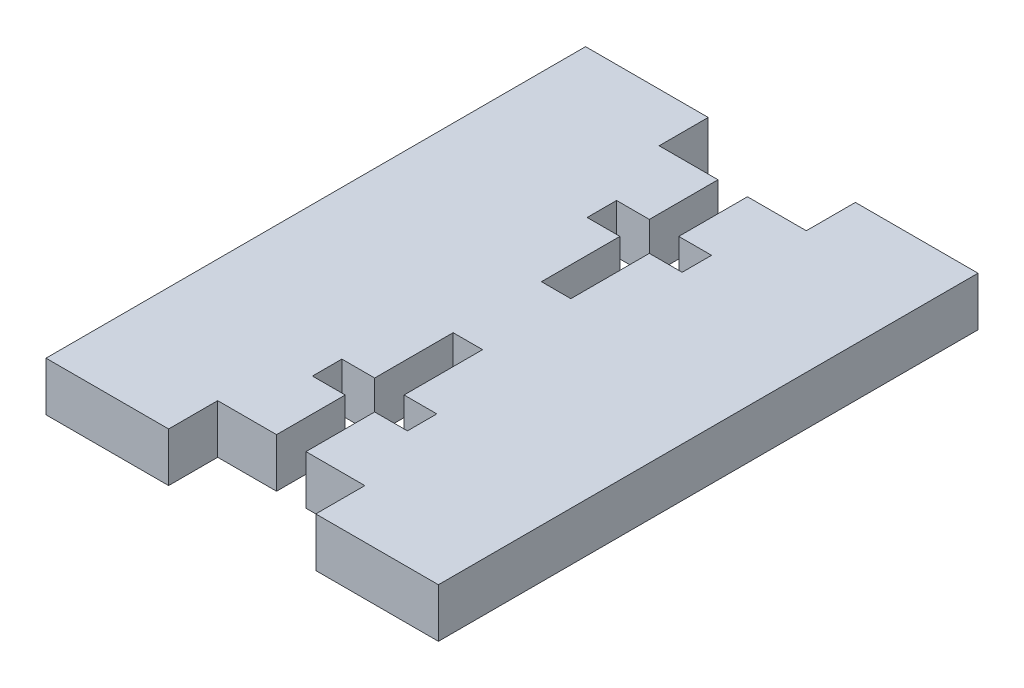
ISO-10303-21;
HEADER;
FILE_DESCRIPTION(('STEP AP214'),'2;1');
FILE_NAME('part.step','',(''),(''),'','','');
FILE_SCHEMA(('AUTOMOTIVE_DESIGN { 1 0 10303 214 1 1 1 1 }'));
ENDSEC;
DATA;
#1=APPLICATION_CONTEXT('core data for automotive mechanical design processes');
#2=APPLICATION_PROTOCOL_DEFINITION('international standard','automotive_design',2000,#1);
#3=PRODUCT_CONTEXT('',#1,'mechanical');
#4=PRODUCT('Part','Part','',(#3));
#5=PRODUCT_RELATED_PRODUCT_CATEGORY('part','',(#4));
#6=PRODUCT_DEFINITION_FORMATION('','',#4);
#7=PRODUCT_DEFINITION_CONTEXT('part definition',#1,'design');
#8=PRODUCT_DEFINITION('design','',#6,#7);
#9=PRODUCT_DEFINITION_SHAPE('','',#8);
#10=(LENGTH_UNIT() NAMED_UNIT(*) SI_UNIT(.MILLI.,.METRE.));
#11=(NAMED_UNIT(*) PLANE_ANGLE_UNIT() SI_UNIT($,.RADIAN.));
#12=(NAMED_UNIT(*) SI_UNIT($,.STERADIAN.) SOLID_ANGLE_UNIT());
#13=UNCERTAINTY_MEASURE_WITH_UNIT(LENGTH_MEASURE(1.E-05),#10,'distance_accuracy_value','');
#14=(GEOMETRIC_REPRESENTATION_CONTEXT(3) GLOBAL_UNCERTAINTY_ASSIGNED_CONTEXT((#13)) GLOBAL_UNIT_ASSIGNED_CONTEXT((#10,
#11,#12)) REPRESENTATION_CONTEXT('',''));
#15=CARTESIAN_POINT('',(0.,0.,0.));
#16=DIRECTION('',(0.,0.,1.));
#17=DIRECTION('',(1.,0.,0.));
#18=AXIS2_PLACEMENT_3D('',#15,#16,#17);
#19=CARTESIAN_POINT('',(-42.0649491402793,-5.,21.7189241382306));
#20=DIRECTION('',(0.,0.,-1.));
#21=DIRECTION('',(1.,0.,0.));
#22=AXIS2_PLACEMENT_3D('',#19,#20,#21);
#23=PLANE('',#22);
#24=DIRECTION('',(1.,0.,0.));
#25=VECTOR('',#24,1.);
#26=CARTESIAN_POINT('',(-42.0649491402793,0.,21.7189241382306));
#27=LINE('',#26,#25);
#28=CARTESIAN_POINT('',(-42.0649491402793,0.,21.7189241382306));
#29=VERTEX_POINT('',#28);
#30=CARTESIAN_POINT('',(-36.0649491402793,0.,21.7189241382306));
#31=VERTEX_POINT('',#30);
#32=EDGE_CURVE('E476',#29,#31,#27,.T.);
#33=ORIENTED_EDGE('',*,*,#32,.F.);
#34=DIRECTION('',(0.,1.,0.));
#35=VECTOR('',#34,1.);
#36=CARTESIAN_POINT('',(-42.0649491402793,-5.,21.7189241382306));
#37=LINE('',#36,#35);
#38=CARTESIAN_POINT('',(-42.0649491402793,-5.,21.7189241382306));
#39=VERTEX_POINT('',#38);
#40=EDGE_CURVE('E486',#39,#29,#37,.T.);
#41=ORIENTED_EDGE('',*,*,#40,.F.);
#42=DIRECTION('',(1.,0.,0.));
#43=VECTOR('',#42,1.);
#44=CARTESIAN_POINT('',(-42.0649491402793,-5.,21.7189241382306));
#45=LINE('',#44,#43);
#46=CARTESIAN_POINT('',(-36.0649491402793,-5.,21.7189241382306));
#47=VERTEX_POINT('',#46);
#48=EDGE_CURVE('E468',#39,#47,#45,.T.);
#49=ORIENTED_EDGE('',*,*,#48,.T.);
#50=DIRECTION('',(0.,1.,0.));
#51=VECTOR('',#50,1.);
#52=CARTESIAN_POINT('',(-36.0649491402793,-5.,21.7189241382306));
#53=LINE('',#52,#51);
#54=EDGE_CURVE('E362',#47,#31,#53,.T.);
#55=ORIENTED_EDGE('',*,*,#54,.T.);
#56=EDGE_LOOP('',(#33,#41,#49,#55));
#57=FACE_BOUND('',#56,.T.);
#58=ADVANCED_FACE('F37',(#57),#23,.F.);
#59=CARTESIAN_POINT('',(-42.0649491402793,-5.,-23.2810758617694));
#60=DIRECTION('',(0.,0.,1.));
#61=DIRECTION('',(-1.,0.,0.));
#62=AXIS2_PLACEMENT_3D('',#59,#60,#61);
#63=PLANE('',#62);
#64=DIRECTION('',(-1.,0.,0.));
#65=VECTOR('',#64,1.);
#66=CARTESIAN_POINT('',(-42.0649491402793,0.,-23.2810758617694));
#67=LINE('',#66,#65);
#68=CARTESIAN_POINT('',(-27.0649491402793,0.,-23.2810758617694));
#69=VERTEX_POINT('',#68);
#70=CARTESIAN_POINT('',(-33.0649491402793,0.,-23.2810758617694));
#71=VERTEX_POINT('',#70);
#72=EDGE_CURVE('E494',#69,#71,#67,.T.);
#73=ORIENTED_EDGE('',*,*,#72,.F.);
#74=DIRECTION('',(0.,1.,0.));
#75=VECTOR('',#74,1.);
#76=CARTESIAN_POINT('',(-27.0649491402793,-5.,-23.2810758617694));
#77=LINE('',#76,#75);
#78=CARTESIAN_POINT('',(-27.0649491402793,-5.,-23.2810758617694));
#79=VERTEX_POINT('',#78);
#80=EDGE_CURVE('E510',#79,#69,#77,.T.);
#81=ORIENTED_EDGE('',*,*,#80,.F.);
#82=DIRECTION('',(-1.,0.,0.));
#83=VECTOR('',#82,1.);
#84=CARTESIAN_POINT('',(-42.0649491402793,-5.,-23.2810758617694));
#85=LINE('',#84,#83);
#86=CARTESIAN_POINT('',(-33.0649491402793,-5.,-23.2810758617694));
#87=VERTEX_POINT('',#86);
#88=EDGE_CURVE('E497',#79,#87,#85,.T.);
#89=ORIENTED_EDGE('',*,*,#88,.T.);
#90=DIRECTION('',(0.,1.,0.));
#91=VECTOR('',#90,1.);
#92=CARTESIAN_POINT('',(-33.0649491402793,-5.,-23.2810758617694));
#93=LINE('',#92,#91);
#94=EDGE_CURVE('E457',#87,#71,#93,.T.);
#95=ORIENTED_EDGE('',*,*,#94,.T.);
#96=EDGE_LOOP('',(#73,#81,#89,#95));
#97=FACE_BOUND('',#96,.T.);
#98=ADVANCED_FACE('F603',(#97),#63,.F.);
#99=CARTESIAN_POINT('',(-54.5649491402793,-5.,26.7189241382306));
#100=DIRECTION('',(0.,0.,1.));
#101=DIRECTION('',(-1.,0.,0.));
#102=AXIS2_PLACEMENT_3D('',#99,#100,#101);
#103=PLANE('',#102);
#104=DIRECTION('',(0.,1.,0.));
#105=VECTOR('',#104,1.);
#106=CARTESIAN_POINT('',(-27.0649491402793,-5.,26.7189241382306));
#107=LINE('',#106,#105);
#108=CARTESIAN_POINT('',(-27.0649491402793,-5.,26.7189241382306));
#109=VERTEX_POINT('',#108);
#110=CARTESIAN_POINT('',(-27.0649491402793,0.,26.7189241382306));
#111=VERTEX_POINT('',#110);
#112=EDGE_CURVE('E480',#109,#111,#107,.T.);
#113=ORIENTED_EDGE('',*,*,#112,.F.);
#114=DIRECTION('',(-1.,0.,0.));
#115=VECTOR('',#114,1.);
#116=CARTESIAN_POINT('',(-54.5649491402793,-5.,26.7189241382306));
#117=LINE('',#116,#115);
#118=CARTESIAN_POINT('',(-14.5649491402793,-5.,26.7189241382306));
#119=VERTEX_POINT('',#118);
#120=EDGE_CURVE('E528',#119,#109,#117,.T.);
#121=ORIENTED_EDGE('',*,*,#120,.F.);
#122=DIRECTION('',(0.,1.,0.));
#123=VECTOR('',#122,1.);
#124=CARTESIAN_POINT('',(-14.5649491402793,-5.,26.7189241382306));
#125=LINE('',#124,#123);
#126=CARTESIAN_POINT('',(-14.5649491402793,0.,26.7189241382306));
#127=VERTEX_POINT('',#126);
#128=EDGE_CURVE('E46',#119,#127,#125,.T.);
#129=ORIENTED_EDGE('',*,*,#128,.T.);
#130=DIRECTION('',(-1.,0.,0.));
#131=VECTOR('',#130,1.);
#132=CARTESIAN_POINT('',(-54.5649491402793,0.,26.7189241382306));
#133=LINE('',#132,#131);
#134=EDGE_CURVE('E521',#127,#111,#133,.T.);
#135=ORIENTED_EDGE('',*,*,#134,.T.);
#136=EDGE_LOOP('',(#113,#121,#129,#135));
#137=FACE_BOUND('',#136,.T.);
#138=ADVANCED_FACE('F609',(#137),#103,.T.);
#139=CARTESIAN_POINT('',(-54.5649491402793,-5.,-28.2810758617694));
#140=DIRECTION('',(0.,0.,-1.));
#141=DIRECTION('',(1.,0.,0.));
#142=AXIS2_PLACEMENT_3D('',#139,#140,#141);
#143=PLANE('',#142);
#144=DIRECTION('',(0.,1.,0.));
#145=VECTOR('',#144,1.);
#146=CARTESIAN_POINT('',(-42.0649491402793,-5.,-28.2810758617694));
#147=LINE('',#146,#145);
#148=CARTESIAN_POINT('',(-42.0649491402793,-5.,-28.2810758617694));
#149=VERTEX_POINT('',#148);
#150=CARTESIAN_POINT('',(-42.0649491402793,0.,-28.2810758617694));
#151=VERTEX_POINT('',#150);
#152=EDGE_CURVE('E500',#149,#151,#147,.T.);
#153=ORIENTED_EDGE('',*,*,#152,.F.);
#154=DIRECTION('',(1.,0.,0.));
#155=VECTOR('',#154,1.);
#156=CARTESIAN_POINT('',(-54.5649491402793,-5.,-28.2810758617694));
#157=LINE('',#156,#155);
#158=CARTESIAN_POINT('',(-54.5649491402793,-5.,-28.2810758617694));
#159=VERTEX_POINT('',#158);
#160=EDGE_CURVE('E522',#159,#149,#157,.T.);
#161=ORIENTED_EDGE('',*,*,#160,.F.);
#162=DIRECTION('',(0.,1.,0.));
#163=VECTOR('',#162,1.);
#164=CARTESIAN_POINT('',(-54.5649491402793,-5.,-28.2810758617694));
#165=LINE('',#164,#163);
#166=CARTESIAN_POINT('',(-54.5649491402793,0.,-28.2810758617694));
#167=VERTEX_POINT('',#166);
#168=EDGE_CURVE('E41',#159,#167,#165,.T.);
#169=ORIENTED_EDGE('',*,*,#168,.T.);
#170=DIRECTION('',(1.,0.,0.));
#171=VECTOR('',#170,1.);
#172=CARTESIAN_POINT('',(-54.5649491402793,0.,-28.2810758617694));
#173=LINE('',#172,#171);
#174=EDGE_CURVE('E533',#167,#151,#173,.T.);
#175=ORIENTED_EDGE('',*,*,#174,.T.);
#176=EDGE_LOOP('',(#153,#161,#169,#175));
#177=FACE_BOUND('',#176,.T.);
#178=ADVANCED_FACE('F553',(#177),#143,.T.);
#179=CARTESIAN_POINT('',(-54.5649491402793,-5.,-28.2810758617694));
#180=DIRECTION('',(-1.,0.,0.));
#181=DIRECTION('',(0.,0.,-1.));
#182=AXIS2_PLACEMENT_3D('',#179,#180,#181);
#183=PLANE('',#182);
#184=DIRECTION('',(0.,0.,-1.));
#185=VECTOR('',#184,1.);
#186=CARTESIAN_POINT('',(-54.5649491402793,0.,-28.2810758617694));
#187=LINE('',#186,#185);
#188=CARTESIAN_POINT('',(-54.5649491402793,0.,26.7189241382306));
#189=VERTEX_POINT('',#188);
#190=EDGE_CURVE('E509',#189,#167,#187,.T.);
#191=ORIENTED_EDGE('',*,*,#190,.T.);
#192=ORIENTED_EDGE('',*,*,#168,.F.);
#193=DIRECTION('',(0.,0.,-1.));
#194=VECTOR('',#193,1.);
#195=CARTESIAN_POINT('',(-54.5649491402793,-5.,-28.2810758617694));
#196=LINE('',#195,#194);
#197=CARTESIAN_POINT('',(-54.5649491402793,-5.,26.7189241382306));
#198=VERTEX_POINT('',#197);
#199=EDGE_CURVE('E518',#198,#159,#196,.T.);
#200=ORIENTED_EDGE('',*,*,#199,.F.);
#201=DIRECTION('',(0.,1.,0.));
#202=VECTOR('',#201,1.);
#203=CARTESIAN_POINT('',(-54.5649491402793,-5.,26.7189241382306));
#204=LINE('',#203,#202);
#205=EDGE_CURVE('E11',#198,#189,#204,.T.);
#206=ORIENTED_EDGE('',*,*,#205,.T.);
#207=EDGE_LOOP('',(#191,#192,#200,#206));
#208=FACE_BOUND('',#207,.T.);
#209=ADVANCED_FACE('F39',(#208),#183,.T.);
#210=DIRECTION('',(0.,1.,0.));
#211=VECTOR('',#210,1.);
#212=CARTESIAN_POINT('',(-42.0649491402793,-5.,26.7189241382306));
#213=LINE('',#212,#211);
#214=CARTESIAN_POINT('',(-42.0649491402793,-5.,26.7189241382306));
#215=VERTEX_POINT('',#214);
#216=CARTESIAN_POINT('',(-42.0649491402793,0.,26.7189241382306));
#217=VERTEX_POINT('',#216);
#218=EDGE_CURVE('E473',#215,#217,#213,.T.);
#219=ORIENTED_EDGE('',*,*,#218,.T.);
#220=EDGE_CURVE('E538',#217,#189,#133,.T.);
#221=ORIENTED_EDGE('',*,*,#220,.T.);
#222=ORIENTED_EDGE('',*,*,#205,.F.);
#223=EDGE_CURVE('E527',#215,#198,#117,.T.);
#224=ORIENTED_EDGE('',*,*,#223,.F.);
#225=EDGE_LOOP('',(#219,#221,#222,#224));
#226=FACE_BOUND('',#225,.T.);
#227=ADVANCED_FACE('F573',(#226),#103,.T.);
#228=CARTESIAN_POINT('',(-14.5649491402793,-5.,-28.2810758617694));
#229=DIRECTION('',(1.,0.,0.));
#230=DIRECTION('',(0.,0.,1.));
#231=AXIS2_PLACEMENT_3D('',#228,#229,#230);
#232=PLANE('',#231);
#233=DIRECTION('',(0.,0.,1.));
#234=VECTOR('',#233,1.);
#235=CARTESIAN_POINT('',(-14.5649491402793,0.,-28.2810758617694));
#236=LINE('',#235,#234);
#237=CARTESIAN_POINT('',(-14.5649491402793,0.,-28.2810758617694));
#238=VERTEX_POINT('',#237);
#239=EDGE_CURVE('E536',#238,#127,#236,.T.);
#240=ORIENTED_EDGE('',*,*,#239,.T.);
#241=ORIENTED_EDGE('',*,*,#128,.F.);
#242=DIRECTION('',(0.,0.,1.));
#243=VECTOR('',#242,1.);
#244=CARTESIAN_POINT('',(-14.5649491402793,-5.,-28.2810758617694));
#245=LINE('',#244,#243);
#246=CARTESIAN_POINT('',(-14.5649491402793,-5.,-28.2810758617694));
#247=VERTEX_POINT('',#246);
#248=EDGE_CURVE('E525',#247,#119,#245,.T.);
#249=ORIENTED_EDGE('',*,*,#248,.F.);
#250=DIRECTION('',(0.,1.,0.));
#251=VECTOR('',#250,1.);
#252=CARTESIAN_POINT('',(-14.5649491402793,-5.,-28.2810758617694));
#253=LINE('',#252,#251);
#254=EDGE_CURVE('E542',#247,#238,#253,.T.);
#255=ORIENTED_EDGE('',*,*,#254,.T.);
#256=EDGE_LOOP('',(#240,#241,#249,#255));
#257=FACE_BOUND('',#256,.T.);
#258=ADVANCED_FACE('F727',(#257),#232,.T.);
#259=DIRECTION('',(0.,1.,0.));
#260=VECTOR('',#259,1.);
#261=CARTESIAN_POINT('',(-27.0649491402793,-5.,-28.2810758617694));
#262=LINE('',#261,#260);
#263=CARTESIAN_POINT('',(-27.0649491402793,-5.,-28.2810758617694));
#264=VERTEX_POINT('',#263);
#265=CARTESIAN_POINT('',(-27.0649491402793,0.,-28.2810758617694));
#266=VERTEX_POINT('',#265);
#267=EDGE_CURVE('E513',#264,#266,#262,.T.);
#268=ORIENTED_EDGE('',*,*,#267,.T.);
#269=EDGE_CURVE('E532',#266,#238,#173,.T.);
#270=ORIENTED_EDGE('',*,*,#269,.T.);
#271=ORIENTED_EDGE('',*,*,#254,.F.);
#272=EDGE_CURVE('E520',#264,#247,#157,.T.);
#273=ORIENTED_EDGE('',*,*,#272,.F.);
#274=EDGE_LOOP('',(#268,#270,#271,#273));
#275=FACE_BOUND('',#274,.T.);
#276=ADVANCED_FACE('F722',(#275),#143,.T.);
#277=CARTESIAN_POINT('',(0.,-5.,0.));
#278=DIRECTION('',(0.,-1.,0.));
#279=DIRECTION('',(0.,0.,1.));
#280=AXIS2_PLACEMENT_3D('',#277,#278,#279);
#281=PLANE('',#280);
#282=DIRECTION('',(0.,0.,-1.));
#283=VECTOR('',#282,1.);
#284=CARTESIAN_POINT('',(-36.0649491402793,-5.,21.7189241382306));
#285=LINE('',#284,#283);
#286=CARTESIAN_POINT('',(-36.0649491402793,-5.,14.7189241382306));
#287=VERTEX_POINT('',#286);
#288=EDGE_CURVE('E315',#47,#287,#285,.T.);
#289=ORIENTED_EDGE('',*,*,#288,.F.);
#290=ORIENTED_EDGE('',*,*,#48,.F.);
#291=DIRECTION('',(0.,0.,-1.));
#292=VECTOR('',#291,1.);
#293=CARTESIAN_POINT('',(-42.0649491402793,-5.,26.7189241382306));
#294=LINE('',#293,#292);
#295=EDGE_CURVE('E464',#215,#39,#294,.T.);
#296=ORIENTED_EDGE('',*,*,#295,.F.);
#297=ORIENTED_EDGE('',*,*,#223,.T.);
#298=ORIENTED_EDGE('',*,*,#199,.T.);
#299=ORIENTED_EDGE('',*,*,#160,.T.);
#300=DIRECTION('',(0.,0.,-1.));
#301=VECTOR('',#300,1.);
#302=CARTESIAN_POINT('',(-42.0649491402793,-5.,-28.2810758617694));
#303=LINE('',#302,#301);
#304=CARTESIAN_POINT('',(-42.0649491402793,-5.,-23.2810758617694));
#305=VERTEX_POINT('',#304);
#306=EDGE_CURVE('E491',#305,#149,#303,.T.);
#307=ORIENTED_EDGE('',*,*,#306,.F.);
#308=CARTESIAN_POINT('',(-36.0649491402793,-5.,-23.2810758617694));
#309=VERTEX_POINT('',#308);
#310=EDGE_CURVE('E496',#309,#305,#85,.T.);
#311=ORIENTED_EDGE('',*,*,#310,.F.);
#312=DIRECTION('',(0.,0.,-1.));
#313=VECTOR('',#312,1.);
#314=CARTESIAN_POINT('',(-36.0649491402793,-5.,-23.2810758617694));
#315=LINE('',#314,#313);
#316=CARTESIAN_POINT('',(-36.0649491402793,-5.,-16.2810758617694));
#317=VERTEX_POINT('',#316);
#318=EDGE_CURVE('E382',#317,#309,#315,.T.);
#319=ORIENTED_EDGE('',*,*,#318,.F.);
#320=DIRECTION('',(1.,0.,0.));
#321=VECTOR('',#320,1.);
#322=CARTESIAN_POINT('',(-36.0649491402793,-5.,-16.2810758617694));
#323=LINE('',#322,#321);
#324=CARTESIAN_POINT('',(-39.4049491402793,-5.,-16.2810758617694));
#325=VERTEX_POINT('',#324);
#326=EDGE_CURVE('E378',#325,#317,#323,.T.);
#327=ORIENTED_EDGE('',*,*,#326,.F.);
#328=DIRECTION('',(0.,0.,-1.));
#329=VECTOR('',#328,1.);
#330=CARTESIAN_POINT('',(-39.4049491402793,-5.,-16.2810758617694));
#331=LINE('',#330,#329);
#332=CARTESIAN_POINT('',(-39.4049491402793,-5.,-13.2810758617694));
#333=VERTEX_POINT('',#332);
#334=EDGE_CURVE('E375',#333,#325,#331,.T.);
#335=ORIENTED_EDGE('',*,*,#334,.F.);
#336=DIRECTION('',(-1.,0.,0.));
#337=VECTOR('',#336,1.);
#338=CARTESIAN_POINT('',(-39.4049491402793,-5.,-13.2810758617694));
#339=LINE('',#338,#337);
#340=CARTESIAN_POINT('',(-36.0649491402793,-5.,-13.2810758617694));
#341=VERTEX_POINT('',#340);
#342=EDGE_CURVE('E405',#341,#333,#339,.T.);
#343=ORIENTED_EDGE('',*,*,#342,.F.);
#344=DIRECTION('',(0.,0.,-1.));
#345=VECTOR('',#344,1.);
#346=CARTESIAN_POINT('',(-36.0649491402793,-5.,-13.2810758617694));
#347=LINE('',#346,#345);
#348=CARTESIAN_POINT('',(-36.0649491402793,-5.,-5.2810758617694));
#349=VERTEX_POINT('',#348);
#350=EDGE_CURVE('E402',#349,#341,#347,.T.);
#351=ORIENTED_EDGE('',*,*,#350,.F.);
#352=DIRECTION('',(-1.,0.,0.));
#353=VECTOR('',#352,1.);
#354=CARTESIAN_POINT('',(-36.0649491402793,-5.,-5.2810758617694));
#355=LINE('',#354,#353);
#356=CARTESIAN_POINT('',(-33.0649491402793,-5.,-5.2810758617694));
#357=VERTEX_POINT('',#356);
#358=EDGE_CURVE('E399',#357,#349,#355,.T.);
#359=ORIENTED_EDGE('',*,*,#358,.F.);
#360=DIRECTION('',(0.,0.,1.));
#361=VECTOR('',#360,1.);
#362=CARTESIAN_POINT('',(-33.0649491402793,-5.,-5.2810758617694));
#363=LINE('',#362,#361);
#364=CARTESIAN_POINT('',(-33.0649491402793,-5.,-13.2810758617694));
#365=VERTEX_POINT('',#364);
#366=EDGE_CURVE('E396',#365,#357,#363,.T.);
#367=ORIENTED_EDGE('',*,*,#366,.F.);
#368=DIRECTION('',(-1.,0.,0.));
#369=VECTOR('',#368,1.);
#370=CARTESIAN_POINT('',(-33.0649491402793,-5.,-13.2810758617694));
#371=LINE('',#370,#369);
#372=CARTESIAN_POINT('',(-29.7249491402793,-5.,-13.2810758617694));
#373=VERTEX_POINT('',#372);
#374=EDGE_CURVE('E393',#373,#365,#371,.T.);
#375=ORIENTED_EDGE('',*,*,#374,.F.);
#376=DIRECTION('',(0.,0.,1.));
#377=VECTOR('',#376,1.);
#378=CARTESIAN_POINT('',(-29.7249491402793,-5.,-13.2810758617694));
#379=LINE('',#378,#377);
#380=CARTESIAN_POINT('',(-29.7249491402793,-5.,-16.2810758617694));
#381=VERTEX_POINT('',#380);
#382=EDGE_CURVE('E390',#381,#373,#379,.T.);
#383=ORIENTED_EDGE('',*,*,#382,.F.);
#384=DIRECTION('',(1.,0.,0.));
#385=VECTOR('',#384,1.);
#386=CARTESIAN_POINT('',(-29.7249491402793,-5.,-16.2810758617694));
#387=LINE('',#386,#385);
#388=CARTESIAN_POINT('',(-33.0649491402793,-5.,-16.2810758617694));
#389=VERTEX_POINT('',#388);
#390=EDGE_CURVE('E387',#389,#381,#387,.T.);
#391=ORIENTED_EDGE('',*,*,#390,.F.);
#392=DIRECTION('',(0.,0.,1.));
#393=VECTOR('',#392,1.);
#394=CARTESIAN_POINT('',(-33.0649491402793,-5.,-16.2810758617694));
#395=LINE('',#394,#393);
#396=EDGE_CURVE('E384',#87,#389,#395,.T.);
#397=ORIENTED_EDGE('',*,*,#396,.F.);
#398=ORIENTED_EDGE('',*,*,#88,.F.);
#399=DIRECTION('',(0.,0.,1.));
#400=VECTOR('',#399,1.);
#401=CARTESIAN_POINT('',(-27.0649491402793,-5.,-28.2810758617694));
#402=LINE('',#401,#400);
#403=EDGE_CURVE('E493',#264,#79,#402,.T.);
#404=ORIENTED_EDGE('',*,*,#403,.F.);
#405=ORIENTED_EDGE('',*,*,#272,.T.);
#406=ORIENTED_EDGE('',*,*,#248,.T.);
#407=ORIENTED_EDGE('',*,*,#120,.T.);
#408=DIRECTION('',(0.,0.,1.));
#409=VECTOR('',#408,1.);
#410=CARTESIAN_POINT('',(-27.0649491402793,-5.,26.7189241382306));
#411=LINE('',#410,#409);
#412=CARTESIAN_POINT('',(-27.0649491402793,-5.,21.7189241382306));
#413=VERTEX_POINT('',#412);
#414=EDGE_CURVE('E471',#413,#109,#411,.T.);
#415=ORIENTED_EDGE('',*,*,#414,.F.);
#416=CARTESIAN_POINT('',(-33.0649491402793,-5.,21.7189241382306));
#417=VERTEX_POINT('',#416);
#418=EDGE_CURVE('E466',#417,#413,#45,.T.);
#419=ORIENTED_EDGE('',*,*,#418,.F.);
#420=DIRECTION('',(0.,0.,1.));
#421=VECTOR('',#420,1.);
#422=CARTESIAN_POINT('',(-33.0649491402793,-5.,14.7189241382306));
#423=LINE('',#422,#421);
#424=CARTESIAN_POINT('',(-33.0649491402793,-5.,14.7189241382306));
#425=VERTEX_POINT('',#424);
#426=EDGE_CURVE('E313',#425,#417,#423,.T.);
#427=ORIENTED_EDGE('',*,*,#426,.F.);
#428=DIRECTION('',(-1.,0.,0.));
#429=VECTOR('',#428,1.);
#430=CARTESIAN_POINT('',(-29.7249491402793,-5.,14.7189241382306));
#431=LINE('',#430,#429);
#432=CARTESIAN_POINT('',(-29.7249491402793,-5.,14.7189241382306));
#433=VERTEX_POINT('',#432);
#434=EDGE_CURVE('E310',#433,#425,#431,.T.);
#435=ORIENTED_EDGE('',*,*,#434,.F.);
#436=DIRECTION('',(0.,0.,1.));
#437=VECTOR('',#436,1.);
#438=CARTESIAN_POINT('',(-29.7249491402793,-5.,11.7189241382306));
#439=LINE('',#438,#437);
#440=CARTESIAN_POINT('',(-29.7249491402793,-5.,11.7189241382306));
#441=VERTEX_POINT('',#440);
#442=EDGE_CURVE('E307',#441,#433,#439,.T.);
#443=ORIENTED_EDGE('',*,*,#442,.F.);
#444=DIRECTION('',(1.,0.,0.));
#445=VECTOR('',#444,1.);
#446=CARTESIAN_POINT('',(-33.0649491402794,-5.,11.7189241382306));
#447=LINE('',#446,#445);
#448=CARTESIAN_POINT('',(-33.0649491402794,-5.,11.7189241382306));
#449=VERTEX_POINT('',#448);
#450=EDGE_CURVE('E302',#449,#441,#447,.T.);
#451=ORIENTED_EDGE('',*,*,#450,.F.);
#452=DIRECTION('',(0.,0.,1.));
#453=VECTOR('',#452,1.);
#454=CARTESIAN_POINT('',(-33.0649491402793,-5.,3.71892413823061));
#455=LINE('',#454,#453);
#456=CARTESIAN_POINT('',(-33.0649491402793,-5.,3.71892413823061));
#457=VERTEX_POINT('',#456);
#458=EDGE_CURVE('E300',#457,#449,#455,.T.);
#459=ORIENTED_EDGE('',*,*,#458,.F.);
#460=DIRECTION('',(1.,0.,0.));
#461=VECTOR('',#460,1.);
#462=CARTESIAN_POINT('',(-36.0649491402793,-5.,3.71892413823061));
#463=LINE('',#462,#461);
#464=CARTESIAN_POINT('',(-36.0649491402793,-5.,3.71892413823061));
#465=VERTEX_POINT('',#464);
#466=EDGE_CURVE('E278',#465,#457,#463,.T.);
#467=ORIENTED_EDGE('',*,*,#466,.F.);
#468=DIRECTION('',(0.,0.,-1.));
#469=VECTOR('',#468,1.);
#470=CARTESIAN_POINT('',(-36.0649491402793,-5.,11.7189241382306));
#471=LINE('',#470,#469);
#472=CARTESIAN_POINT('',(-36.0649491402793,-5.,11.7189241382306));
#473=VERTEX_POINT('',#472);
#474=EDGE_CURVE('E289',#473,#465,#471,.T.);
#475=ORIENTED_EDGE('',*,*,#474,.F.);
#476=DIRECTION('',(1.,0.,0.));
#477=VECTOR('',#476,1.);
#478=CARTESIAN_POINT('',(-39.4049491402793,-5.,11.7189241382306));
#479=LINE('',#478,#477);
#480=CARTESIAN_POINT('',(-39.4049491402793,-5.,11.7189241382306));
#481=VERTEX_POINT('',#480);
#482=EDGE_CURVE('E286',#481,#473,#479,.T.);
#483=ORIENTED_EDGE('',*,*,#482,.F.);
#484=DIRECTION('',(0.,0.,-1.));
#485=VECTOR('',#484,1.);
#486=CARTESIAN_POINT('',(-39.4049491402793,-5.,14.7189241382306));
#487=LINE('',#486,#485);
#488=CARTESIAN_POINT('',(-39.4049491402793,-5.,14.7189241382306));
#489=VERTEX_POINT('',#488);
#490=EDGE_CURVE('E321',#489,#481,#487,.T.);
#491=ORIENTED_EDGE('',*,*,#490,.F.);
#492=DIRECTION('',(-1.,0.,0.));
#493=VECTOR('',#492,1.);
#494=CARTESIAN_POINT('',(-36.0649491402793,-5.,14.7189241382306));
#495=LINE('',#494,#493);
#496=EDGE_CURVE('E318',#287,#489,#495,.T.);
#497=ORIENTED_EDGE('',*,*,#496,.F.);
#498=EDGE_LOOP('',(#289,#290,#296,#297,#298,#299,#307,#311,#319,#327,#335,#343,#351,#359,#367,
#375,#383,#391,#397,#398,#404,#405,#406,#407,#415,#419,#427,#435,#443,#451,#459,#467,#475,#483,
#491,#497));
#499=FACE_BOUND('',#498,.T.);
#500=ADVANCED_FACE('F297',(#499),#281,.T.);
#501=CARTESIAN_POINT('',(0.,0.,0.));
#502=DIRECTION('',(0.,-1.,0.));
#503=DIRECTION('',(0.,0.,1.));
#504=AXIS2_PLACEMENT_3D('',#501,#502,#503);
#505=PLANE('',#504);
#506=DIRECTION('',(-1.,0.,0.));
#507=VECTOR('',#506,1.);
#508=CARTESIAN_POINT('',(-36.0649491402793,0.,14.7189241382306));
#509=LINE('',#508,#507);
#510=CARTESIAN_POINT('',(-36.0649491402793,0.,14.7189241382306));
#511=VERTEX_POINT('',#510);
#512=CARTESIAN_POINT('',(-39.4049491402793,0.,14.7189241382306));
#513=VERTEX_POINT('',#512);
#514=EDGE_CURVE('E346',#511,#513,#509,.T.);
#515=ORIENTED_EDGE('',*,*,#514,.T.);
#516=DIRECTION('',(0.,0.,-1.));
#517=VECTOR('',#516,1.);
#518=CARTESIAN_POINT('',(-39.4049491402793,0.,14.7189241382306));
#519=LINE('',#518,#517);
#520=CARTESIAN_POINT('',(-39.4049491402793,0.,11.7189241382306));
#521=VERTEX_POINT('',#520);
#522=EDGE_CURVE('E349',#513,#521,#519,.T.);
#523=ORIENTED_EDGE('',*,*,#522,.T.);
#524=DIRECTION('',(1.,0.,0.));
#525=VECTOR('',#524,1.);
#526=CARTESIAN_POINT('',(-39.4049491402793,0.,11.7189241382306));
#527=LINE('',#526,#525);
#528=CARTESIAN_POINT('',(-36.0649491402793,0.,11.7189241382306));
#529=VERTEX_POINT('',#528);
#530=EDGE_CURVE('E295',#521,#529,#527,.T.);
#531=ORIENTED_EDGE('',*,*,#530,.T.);
#532=DIRECTION('',(0.,0.,-1.));
#533=VECTOR('',#532,1.);
#534=CARTESIAN_POINT('',(-36.0649491402793,0.,11.7189241382306));
#535=LINE('',#534,#533);
#536=CARTESIAN_POINT('',(-36.0649491402793,0.,3.71892413823061));
#537=VERTEX_POINT('',#536);
#538=EDGE_CURVE('E325',#529,#537,#535,.T.);
#539=ORIENTED_EDGE('',*,*,#538,.T.);
#540=DIRECTION('',(1.,0.,0.));
#541=VECTOR('',#540,1.);
#542=CARTESIAN_POINT('',(-36.0649491402793,0.,3.71892413823061));
#543=LINE('',#542,#541);
#544=CARTESIAN_POINT('',(-33.0649491402793,0.,3.71892413823061));
#545=VERTEX_POINT('',#544);
#546=EDGE_CURVE('E281',#537,#545,#543,.T.);
#547=ORIENTED_EDGE('',*,*,#546,.T.);
#548=DIRECTION('',(0.,0.,1.));
#549=VECTOR('',#548,1.);
#550=CARTESIAN_POINT('',(-33.0649491402793,0.,3.71892413823061));
#551=LINE('',#550,#549);
#552=CARTESIAN_POINT('',(-33.0649491402794,0.,11.7189241382306));
#553=VERTEX_POINT('',#552);
#554=EDGE_CURVE('E328',#545,#553,#551,.T.);
#555=ORIENTED_EDGE('',*,*,#554,.T.);
#556=DIRECTION('',(1.,0.,0.));
#557=VECTOR('',#556,1.);
#558=CARTESIAN_POINT('',(-33.0649491402794,0.,11.7189241382306));
#559=LINE('',#558,#557);
#560=CARTESIAN_POINT('',(-29.7249491402793,0.,11.7189241382306));
#561=VERTEX_POINT('',#560);
#562=EDGE_CURVE('E331',#553,#561,#559,.T.);
#563=ORIENTED_EDGE('',*,*,#562,.T.);
#564=DIRECTION('',(0.,0.,1.));
#565=VECTOR('',#564,1.);
#566=CARTESIAN_POINT('',(-29.7249491402793,0.,11.7189241382306));
#567=LINE('',#566,#565);
#568=CARTESIAN_POINT('',(-29.7249491402793,0.,14.7189241382306));
#569=VERTEX_POINT('',#568);
#570=EDGE_CURVE('E334',#561,#569,#567,.T.);
#571=ORIENTED_EDGE('',*,*,#570,.T.);
#572=DIRECTION('',(-1.,0.,0.));
#573=VECTOR('',#572,1.);
#574=CARTESIAN_POINT('',(-29.7249491402793,0.,14.7189241382306));
#575=LINE('',#574,#573);
#576=CARTESIAN_POINT('',(-33.0649491402793,0.,14.7189241382306));
#577=VERTEX_POINT('',#576);
#578=EDGE_CURVE('E337',#569,#577,#575,.T.);
#579=ORIENTED_EDGE('',*,*,#578,.T.);
#580=DIRECTION('',(0.,0.,1.));
#581=VECTOR('',#580,1.);
#582=CARTESIAN_POINT('',(-33.0649491402793,0.,14.7189241382306));
#583=LINE('',#582,#581);
#584=CARTESIAN_POINT('',(-33.0649491402793,0.,21.7189241382306));
#585=VERTEX_POINT('',#584);
#586=EDGE_CURVE('E340',#577,#585,#583,.T.);
#587=ORIENTED_EDGE('',*,*,#586,.T.);
#588=CARTESIAN_POINT('',(-27.0649491402793,0.,21.7189241382306));
#589=VERTEX_POINT('',#588);
#590=EDGE_CURVE('E475',#585,#589,#27,.T.);
#591=ORIENTED_EDGE('',*,*,#590,.T.);
#592=DIRECTION('',(0.,0.,1.));
#593=VECTOR('',#592,1.);
#594=CARTESIAN_POINT('',(-27.0649491402793,0.,26.7189241382306));
#595=LINE('',#594,#593);
#596=EDGE_CURVE('E467',#589,#111,#595,.T.);
#597=ORIENTED_EDGE('',*,*,#596,.T.);
#598=ORIENTED_EDGE('',*,*,#134,.F.);
#599=ORIENTED_EDGE('',*,*,#239,.F.);
#600=ORIENTED_EDGE('',*,*,#269,.F.);
#601=DIRECTION('',(0.,0.,1.));
#602=VECTOR('',#601,1.);
#603=CARTESIAN_POINT('',(-27.0649491402793,0.,-28.2810758617694));
#604=LINE('',#603,#602);
#605=EDGE_CURVE('E502',#266,#69,#604,.T.);
#606=ORIENTED_EDGE('',*,*,#605,.T.);
#607=ORIENTED_EDGE('',*,*,#72,.T.);
#608=DIRECTION('',(0.,0.,1.));
#609=VECTOR('',#608,1.);
#610=CARTESIAN_POINT('',(-33.0649491402793,0.,-16.2810758617694));
#611=LINE('',#610,#609);
#612=CARTESIAN_POINT('',(-33.0649491402793,0.,-16.2810758617694));
#613=VERTEX_POINT('',#612);
#614=EDGE_CURVE('E417',#71,#613,#611,.T.);
#615=ORIENTED_EDGE('',*,*,#614,.T.);
#616=DIRECTION('',(1.,0.,0.));
#617=VECTOR('',#616,1.);
#618=CARTESIAN_POINT('',(-29.7249491402793,0.,-16.2810758617694));
#619=LINE('',#618,#617);
#620=CARTESIAN_POINT('',(-29.7249491402793,0.,-16.2810758617694));
#621=VERTEX_POINT('',#620);
#622=EDGE_CURVE('E420',#613,#621,#619,.T.);
#623=ORIENTED_EDGE('',*,*,#622,.T.);
#624=DIRECTION('',(0.,0.,1.));
#625=VECTOR('',#624,1.);
#626=CARTESIAN_POINT('',(-29.7249491402793,0.,-13.2810758617694));
#627=LINE('',#626,#625);
#628=CARTESIAN_POINT('',(-29.7249491402793,0.,-13.2810758617694));
#629=VERTEX_POINT('',#628);
#630=EDGE_CURVE('E423',#621,#629,#627,.T.);
#631=ORIENTED_EDGE('',*,*,#630,.T.);
#632=DIRECTION('',(-1.,0.,0.));
#633=VECTOR('',#632,1.);
#634=CARTESIAN_POINT('',(-33.0649491402793,0.,-13.2810758617694));
#635=LINE('',#634,#633);
#636=CARTESIAN_POINT('',(-33.0649491402793,0.,-13.2810758617694));
#637=VERTEX_POINT('',#636);
#638=EDGE_CURVE('E426',#629,#637,#635,.T.);
#639=ORIENTED_EDGE('',*,*,#638,.T.);
#640=DIRECTION('',(0.,0.,1.));
#641=VECTOR('',#640,1.);
#642=CARTESIAN_POINT('',(-33.0649491402793,0.,-5.2810758617694));
#643=LINE('',#642,#641);
#644=CARTESIAN_POINT('',(-33.0649491402793,0.,-5.2810758617694));
#645=VERTEX_POINT('',#644);
#646=EDGE_CURVE('E429',#637,#645,#643,.T.);
#647=ORIENTED_EDGE('',*,*,#646,.T.);
#648=DIRECTION('',(-1.,0.,0.));
#649=VECTOR('',#648,1.);
#650=CARTESIAN_POINT('',(-36.0649491402793,0.,-5.2810758617694));
#651=LINE('',#650,#649);
#652=CARTESIAN_POINT('',(-36.0649491402793,0.,-5.2810758617694));
#653=VERTEX_POINT('',#652);
#654=EDGE_CURVE('E432',#645,#653,#651,.T.);
#655=ORIENTED_EDGE('',*,*,#654,.T.);
#656=DIRECTION('',(0.,0.,-1.));
#657=VECTOR('',#656,1.);
#658=CARTESIAN_POINT('',(-36.0649491402793,0.,-13.2810758617694));
#659=LINE('',#658,#657);
#660=CARTESIAN_POINT('',(-36.0649491402793,0.,-13.2810758617694));
#661=VERTEX_POINT('',#660);
#662=EDGE_CURVE('E435',#653,#661,#659,.T.);
#663=ORIENTED_EDGE('',*,*,#662,.T.);
#664=DIRECTION('',(-1.,0.,0.));
#665=VECTOR('',#664,1.);
#666=CARTESIAN_POINT('',(-39.4049491402793,0.,-13.2810758617694));
#667=LINE('',#666,#665);
#668=CARTESIAN_POINT('',(-39.4049491402793,0.,-13.2810758617694));
#669=VERTEX_POINT('',#668);
#670=EDGE_CURVE('E379',#661,#669,#667,.T.);
#671=ORIENTED_EDGE('',*,*,#670,.T.);
#672=DIRECTION('',(0.,0.,-1.));
#673=VECTOR('',#672,1.);
#674=CARTESIAN_POINT('',(-39.4049491402793,0.,-16.2810758617694));
#675=LINE('',#674,#673);
#676=CARTESIAN_POINT('',(-39.4049491402793,0.,-16.2810758617694));
#677=VERTEX_POINT('',#676);
#678=EDGE_CURVE('E355',#669,#677,#675,.T.);
#679=ORIENTED_EDGE('',*,*,#678,.T.);
#680=DIRECTION('',(1.,0.,0.));
#681=VECTOR('',#680,1.);
#682=CARTESIAN_POINT('',(-36.0649491402793,0.,-16.2810758617694));
#683=LINE('',#682,#681);
#684=CARTESIAN_POINT('',(-36.0649491402793,0.,-16.2810758617694));
#685=VERTEX_POINT('',#684);
#686=EDGE_CURVE('E411',#677,#685,#683,.T.);
#687=ORIENTED_EDGE('',*,*,#686,.T.);
#688=DIRECTION('',(0.,0.,-1.));
#689=VECTOR('',#688,1.);
#690=CARTESIAN_POINT('',(-36.0649491402793,0.,-23.2810758617694));
#691=LINE('',#690,#689);
#692=CARTESIAN_POINT('',(-36.0649491402793,0.,-23.2810758617694));
#693=VERTEX_POINT('',#692);
#694=EDGE_CURVE('E414',#685,#693,#691,.T.);
#695=ORIENTED_EDGE('',*,*,#694,.T.);
#696=CARTESIAN_POINT('',(-42.0649491402793,0.,-23.2810758617694));
#697=VERTEX_POINT('',#696);
#698=EDGE_CURVE('E504',#693,#697,#67,.T.);
#699=ORIENTED_EDGE('',*,*,#698,.T.);
#700=DIRECTION('',(0.,0.,-1.));
#701=VECTOR('',#700,1.);
#702=CARTESIAN_POINT('',(-42.0649491402793,0.,-28.2810758617694));
#703=LINE('',#702,#701);
#704=EDGE_CURVE('E483',#697,#151,#703,.T.);
#705=ORIENTED_EDGE('',*,*,#704,.T.);
#706=ORIENTED_EDGE('',*,*,#174,.F.);
#707=ORIENTED_EDGE('',*,*,#190,.F.);
#708=ORIENTED_EDGE('',*,*,#220,.F.);
#709=DIRECTION('',(0.,0.,-1.));
#710=VECTOR('',#709,1.);
#711=CARTESIAN_POINT('',(-42.0649491402793,0.,26.7189241382306));
#712=LINE('',#711,#710);
#713=EDGE_CURVE('E442',#217,#29,#712,.T.);
#714=ORIENTED_EDGE('',*,*,#713,.T.);
#715=ORIENTED_EDGE('',*,*,#32,.T.);
#716=DIRECTION('',(0.,0.,-1.));
#717=VECTOR('',#716,1.);
#718=CARTESIAN_POINT('',(-36.0649491402793,0.,21.7189241382306));
#719=LINE('',#718,#717);
#720=EDGE_CURVE('E343',#31,#511,#719,.T.);
#721=ORIENTED_EDGE('',*,*,#720,.T.);
#722=EDGE_LOOP('',(#515,#523,#531,#539,#547,#555,#563,#571,#579,#587,#591,#597,#598,#599,#600,
#606,#607,#615,#623,#631,#639,#647,#655,#663,#671,#679,#687,#695,#699,#705,#706,#707,#708,#714,
#715,#721));
#723=FACE_BOUND('',#722,.T.);
#724=ADVANCED_FACE('F561',(#723),#505,.F.);
#725=CARTESIAN_POINT('',(-42.0649491402793,-5.,-28.2810758617694));
#726=DIRECTION('',(-1.,0.,0.));
#727=DIRECTION('',(0.,0.,-1.));
#728=AXIS2_PLACEMENT_3D('',#725,#726,#727);
#729=PLANE('',#728);
#730=ORIENTED_EDGE('',*,*,#704,.F.);
#731=DIRECTION('',(0.,1.,0.));
#732=VECTOR('',#731,1.);
#733=CARTESIAN_POINT('',(-42.0649491402793,-5.,-23.2810758617694));
#734=LINE('',#733,#732);
#735=EDGE_CURVE('E507',#305,#697,#734,.T.);
#736=ORIENTED_EDGE('',*,*,#735,.F.);
#737=ORIENTED_EDGE('',*,*,#306,.T.);
#738=ORIENTED_EDGE('',*,*,#152,.T.);
#739=EDGE_LOOP('',(#730,#736,#737,#738));
#740=FACE_BOUND('',#739,.T.);
#741=ADVANCED_FACE('F565',(#740),#729,.F.);
#742=ORIENTED_EDGE('',*,*,#310,.T.);
#743=ORIENTED_EDGE('',*,*,#735,.T.);
#744=ORIENTED_EDGE('',*,*,#698,.F.);
#745=DIRECTION('',(0.,1.,0.));
#746=VECTOR('',#745,1.);
#747=CARTESIAN_POINT('',(-36.0649491402793,-5.,-23.2810758617694));
#748=LINE('',#747,#746);
#749=EDGE_CURVE('E62',#309,#693,#748,.T.);
#750=ORIENTED_EDGE('',*,*,#749,.F.);
#751=EDGE_LOOP('',(#742,#743,#744,#750));
#752=FACE_BOUND('',#751,.T.);
#753=ADVANCED_FACE('F612',(#752),#63,.F.);
#754=CARTESIAN_POINT('',(-27.0649491402793,-5.,-28.2810758617694));
#755=DIRECTION('',(1.,0.,0.));
#756=DIRECTION('',(0.,0.,1.));
#757=AXIS2_PLACEMENT_3D('',#754,#755,#756);
#758=PLANE('',#757);
#759=ORIENTED_EDGE('',*,*,#605,.F.);
#760=ORIENTED_EDGE('',*,*,#267,.F.);
#761=ORIENTED_EDGE('',*,*,#403,.T.);
#762=ORIENTED_EDGE('',*,*,#80,.T.);
#763=EDGE_LOOP('',(#759,#760,#761,#762));
#764=FACE_BOUND('',#763,.T.);
#765=ADVANCED_FACE('F623',(#764),#758,.F.);
#766=CARTESIAN_POINT('',(-27.0649491402793,-5.,26.7189241382306));
#767=DIRECTION('',(1.,0.,0.));
#768=DIRECTION('',(0.,0.,1.));
#769=AXIS2_PLACEMENT_3D('',#766,#767,#768);
#770=PLANE('',#769);
#771=ORIENTED_EDGE('',*,*,#596,.F.);
#772=DIRECTION('',(0.,1.,0.));
#773=VECTOR('',#772,1.);
#774=CARTESIAN_POINT('',(-27.0649491402793,-5.,21.7189241382306));
#775=LINE('',#774,#773);
#776=EDGE_CURVE('E484',#413,#589,#775,.T.);
#777=ORIENTED_EDGE('',*,*,#776,.F.);
#778=ORIENTED_EDGE('',*,*,#414,.T.);
#779=ORIENTED_EDGE('',*,*,#112,.T.);
#780=EDGE_LOOP('',(#771,#777,#778,#779));
#781=FACE_BOUND('',#780,.T.);
#782=ADVANCED_FACE('F616',(#781),#770,.F.);
#783=ORIENTED_EDGE('',*,*,#418,.T.);
#784=ORIENTED_EDGE('',*,*,#776,.T.);
#785=ORIENTED_EDGE('',*,*,#590,.F.);
#786=DIRECTION('',(0.,1.,0.));
#787=VECTOR('',#786,1.);
#788=CARTESIAN_POINT('',(-33.0649491402793,-5.,21.7189241382306));
#789=LINE('',#788,#787);
#790=EDGE_CURVE('E54',#417,#585,#789,.T.);
#791=ORIENTED_EDGE('',*,*,#790,.F.);
#792=EDGE_LOOP('',(#783,#784,#785,#791));
#793=FACE_BOUND('',#792,.T.);
#794=ADVANCED_FACE('F605',(#793),#23,.F.);
#795=CARTESIAN_POINT('',(-42.0649491402793,-5.,26.7189241382306));
#796=DIRECTION('',(-1.,0.,0.));
#797=DIRECTION('',(0.,0.,-1.));
#798=AXIS2_PLACEMENT_3D('',#795,#796,#797);
#799=PLANE('',#798);
#800=ORIENTED_EDGE('',*,*,#713,.F.);
#801=ORIENTED_EDGE('',*,*,#218,.F.);
#802=ORIENTED_EDGE('',*,*,#295,.T.);
#803=ORIENTED_EDGE('',*,*,#40,.T.);
#804=EDGE_LOOP('',(#800,#801,#802,#803));
#805=FACE_BOUND('',#804,.T.);
#806=ADVANCED_FACE('F577',(#805),#799,.F.);
#807=CARTESIAN_POINT('',(-39.4049491402793,-5.,-16.2810758617694));
#808=DIRECTION('',(-1.,0.,0.));
#809=DIRECTION('',(0.,0.,-1.));
#810=AXIS2_PLACEMENT_3D('',#807,#808,#809);
#811=PLANE('',#810);
#812=ORIENTED_EDGE('',*,*,#678,.F.);
#813=DIRECTION('',(0.,1.,0.));
#814=VECTOR('',#813,1.);
#815=CARTESIAN_POINT('',(-39.4049491402793,-5.,-13.2810758617694));
#816=LINE('',#815,#814);
#817=EDGE_CURVE('E440',#333,#669,#816,.T.);
#818=ORIENTED_EDGE('',*,*,#817,.F.);
#819=ORIENTED_EDGE('',*,*,#334,.T.);
#820=DIRECTION('',(0.,1.,0.));
#821=VECTOR('',#820,1.);
#822=CARTESIAN_POINT('',(-39.4049491402793,-5.,-16.2810758617694));
#823=LINE('',#822,#821);
#824=EDGE_CURVE('E408',#325,#677,#823,.T.);
#825=ORIENTED_EDGE('',*,*,#824,.T.);
#826=EDGE_LOOP('',(#812,#818,#819,#825));
#827=FACE_BOUND('',#826,.T.);
#828=ADVANCED_FACE('F622',(#827),#811,.F.);
#829=CARTESIAN_POINT('',(-39.4049491402793,-5.,-13.2810758617694));
#830=DIRECTION('',(0.,0.,1.));
#831=DIRECTION('',(-1.,0.,0.));
#832=AXIS2_PLACEMENT_3D('',#829,#830,#831);
#833=PLANE('',#832);
#834=ORIENTED_EDGE('',*,*,#670,.F.);
#835=DIRECTION('',(0.,1.,0.));
#836=VECTOR('',#835,1.);
#837=CARTESIAN_POINT('',(-36.0649491402793,-5.,-13.2810758617694));
#838=LINE('',#837,#836);
#839=EDGE_CURVE('E443',#341,#661,#838,.T.);
#840=ORIENTED_EDGE('',*,*,#839,.F.);
#841=ORIENTED_EDGE('',*,*,#342,.T.);
#842=ORIENTED_EDGE('',*,*,#817,.T.);
#843=EDGE_LOOP('',(#834,#840,#841,#842));
#844=FACE_BOUND('',#843,.T.);
#845=ADVANCED_FACE('F659',(#844),#833,.F.);
#846=CARTESIAN_POINT('',(-36.0649491402793,-5.,-13.2810758617694));
#847=DIRECTION('',(-1.,0.,0.));
#848=DIRECTION('',(0.,0.,-1.));
#849=AXIS2_PLACEMENT_3D('',#846,#847,#848);
#850=PLANE('',#849);
#851=ORIENTED_EDGE('',*,*,#662,.F.);
#852=DIRECTION('',(0.,1.,0.));
#853=VECTOR('',#852,1.);
#854=CARTESIAN_POINT('',(-36.0649491402793,-5.,-5.2810758617694));
#855=LINE('',#854,#853);
#856=EDGE_CURVE('E445',#349,#653,#855,.T.);
#857=ORIENTED_EDGE('',*,*,#856,.F.);
#858=ORIENTED_EDGE('',*,*,#350,.T.);
#859=ORIENTED_EDGE('',*,*,#839,.T.);
#860=EDGE_LOOP('',(#851,#857,#858,#859));
#861=FACE_BOUND('',#860,.T.);
#862=ADVANCED_FACE('F662',(#861),#850,.F.);
#863=CARTESIAN_POINT('',(-36.0649491402793,-5.,-5.2810758617694));
#864=DIRECTION('',(0.,0.,1.));
#865=DIRECTION('',(-1.,0.,0.));
#866=AXIS2_PLACEMENT_3D('',#863,#864,#865);
#867=PLANE('',#866);
#868=ORIENTED_EDGE('',*,*,#654,.F.);
#869=DIRECTION('',(0.,1.,0.));
#870=VECTOR('',#869,1.);
#871=CARTESIAN_POINT('',(-33.0649491402793,-5.,-5.2810758617694));
#872=LINE('',#871,#870);
#873=EDGE_CURVE('E447',#357,#645,#872,.T.);
#874=ORIENTED_EDGE('',*,*,#873,.F.);
#875=ORIENTED_EDGE('',*,*,#358,.T.);
#876=ORIENTED_EDGE('',*,*,#856,.T.);
#877=EDGE_LOOP('',(#868,#874,#875,#876));
#878=FACE_BOUND('',#877,.T.);
#879=ADVANCED_FACE('F666',(#878),#867,.F.);
#880=CARTESIAN_POINT('',(-33.0649491402793,-5.,-5.2810758617694));
#881=DIRECTION('',(1.,0.,0.));
#882=DIRECTION('',(0.,0.,1.));
#883=AXIS2_PLACEMENT_3D('',#880,#881,#882);
#884=PLANE('',#883);
#885=ORIENTED_EDGE('',*,*,#646,.F.);
#886=DIRECTION('',(0.,1.,0.));
#887=VECTOR('',#886,1.);
#888=CARTESIAN_POINT('',(-33.0649491402793,-5.,-13.2810758617694));
#889=LINE('',#888,#887);
#890=EDGE_CURVE('E449',#365,#637,#889,.T.);
#891=ORIENTED_EDGE('',*,*,#890,.F.);
#892=ORIENTED_EDGE('',*,*,#366,.T.);
#893=ORIENTED_EDGE('',*,*,#873,.T.);
#894=EDGE_LOOP('',(#885,#891,#892,#893));
#895=FACE_BOUND('',#894,.T.);
#896=ADVANCED_FACE('F670',(#895),#884,.F.);
#897=CARTESIAN_POINT('',(-33.0649491402793,-5.,-13.2810758617694));
#898=DIRECTION('',(0.,0.,1.));
#899=DIRECTION('',(-1.,0.,0.));
#900=AXIS2_PLACEMENT_3D('',#897,#898,#899);
#901=PLANE('',#900);
#902=ORIENTED_EDGE('',*,*,#638,.F.);
#903=DIRECTION('',(0.,1.,0.));
#904=VECTOR('',#903,1.);
#905=CARTESIAN_POINT('',(-29.7249491402793,-5.,-13.2810758617694));
#906=LINE('',#905,#904);
#907=EDGE_CURVE('E451',#373,#629,#906,.T.);
#908=ORIENTED_EDGE('',*,*,#907,.F.);
#909=ORIENTED_EDGE('',*,*,#374,.T.);
#910=ORIENTED_EDGE('',*,*,#890,.T.);
#911=EDGE_LOOP('',(#902,#908,#909,#910));
#912=FACE_BOUND('',#911,.T.);
#913=ADVANCED_FACE('F674',(#912),#901,.F.);
#914=CARTESIAN_POINT('',(-29.7249491402793,-5.,-13.2810758617694));
#915=DIRECTION('',(1.,0.,0.));
#916=DIRECTION('',(0.,0.,1.));
#917=AXIS2_PLACEMENT_3D('',#914,#915,#916);
#918=PLANE('',#917);
#919=ORIENTED_EDGE('',*,*,#630,.F.);
#920=DIRECTION('',(0.,1.,0.));
#921=VECTOR('',#920,1.);
#922=CARTESIAN_POINT('',(-29.7249491402793,-5.,-16.2810758617694));
#923=LINE('',#922,#921);
#924=EDGE_CURVE('E453',#381,#621,#923,.T.);
#925=ORIENTED_EDGE('',*,*,#924,.F.);
#926=ORIENTED_EDGE('',*,*,#382,.T.);
#927=ORIENTED_EDGE('',*,*,#907,.T.);
#928=EDGE_LOOP('',(#919,#925,#926,#927));
#929=FACE_BOUND('',#928,.T.);
#930=ADVANCED_FACE('F678',(#929),#918,.F.);
#931=CARTESIAN_POINT('',(-29.7249491402793,-5.,-16.2810758617694));
#932=DIRECTION('',(0.,0.,-1.));
#933=DIRECTION('',(1.,0.,0.));
#934=AXIS2_PLACEMENT_3D('',#931,#932,#933);
#935=PLANE('',#934);
#936=ORIENTED_EDGE('',*,*,#622,.F.);
#937=DIRECTION('',(0.,1.,0.));
#938=VECTOR('',#937,1.);
#939=CARTESIAN_POINT('',(-33.0649491402793,-5.,-16.2810758617694));
#940=LINE('',#939,#938);
#941=EDGE_CURVE('E455',#389,#613,#940,.T.);
#942=ORIENTED_EDGE('',*,*,#941,.F.);
#943=ORIENTED_EDGE('',*,*,#390,.T.);
#944=ORIENTED_EDGE('',*,*,#924,.T.);
#945=EDGE_LOOP('',(#936,#942,#943,#944));
#946=FACE_BOUND('',#945,.T.);
#947=ADVANCED_FACE('F682',(#946),#935,.F.);
#948=CARTESIAN_POINT('',(-33.0649491402793,-5.,-16.2810758617694));
#949=DIRECTION('',(1.,0.,0.));
#950=DIRECTION('',(0.,0.,1.));
#951=AXIS2_PLACEMENT_3D('',#948,#949,#950);
#952=PLANE('',#951);
#953=ORIENTED_EDGE('',*,*,#614,.F.);
#954=ORIENTED_EDGE('',*,*,#94,.F.);
#955=ORIENTED_EDGE('',*,*,#396,.T.);
#956=ORIENTED_EDGE('',*,*,#941,.T.);
#957=EDGE_LOOP('',(#953,#954,#955,#956));
#958=FACE_BOUND('',#957,.T.);
#959=ADVANCED_FACE('F686',(#958),#952,.F.);
#960=CARTESIAN_POINT('',(-36.0649491402793,-5.,-23.2810758617694));
#961=DIRECTION('',(-1.,0.,0.));
#962=DIRECTION('',(0.,0.,-1.));
#963=AXIS2_PLACEMENT_3D('',#960,#961,#962);
#964=PLANE('',#963);
#965=ORIENTED_EDGE('',*,*,#694,.F.);
#966=DIRECTION('',(0.,1.,0.));
#967=VECTOR('',#966,1.);
#968=CARTESIAN_POINT('',(-36.0649491402793,-5.,-16.2810758617694));
#969=LINE('',#968,#967);
#970=EDGE_CURVE('E461',#317,#685,#969,.T.);
#971=ORIENTED_EDGE('',*,*,#970,.F.);
#972=ORIENTED_EDGE('',*,*,#318,.T.);
#973=ORIENTED_EDGE('',*,*,#749,.T.);
#974=EDGE_LOOP('',(#965,#971,#972,#973));
#975=FACE_BOUND('',#974,.T.);
#976=ADVANCED_FACE('F690',(#975),#964,.F.);
#977=CARTESIAN_POINT('',(-36.0649491402793,-5.,-16.2810758617694));
#978=DIRECTION('',(0.,0.,-1.));
#979=DIRECTION('',(1.,0.,0.));
#980=AXIS2_PLACEMENT_3D('',#977,#978,#979);
#981=PLANE('',#980);
#982=ORIENTED_EDGE('',*,*,#686,.F.);
#983=ORIENTED_EDGE('',*,*,#824,.F.);
#984=ORIENTED_EDGE('',*,*,#326,.T.);
#985=ORIENTED_EDGE('',*,*,#970,.T.);
#986=EDGE_LOOP('',(#982,#983,#984,#985));
#987=FACE_BOUND('',#986,.T.);
#988=ADVANCED_FACE('F600',(#987),#981,.F.);
#989=CARTESIAN_POINT('',(-36.0649491402793,-5.,11.7189241382306));
#990=DIRECTION('',(-1.,0.,0.));
#991=DIRECTION('',(0.,0.,-1.));
#992=AXIS2_PLACEMENT_3D('',#989,#990,#991);
#993=PLANE('',#992);
#994=ORIENTED_EDGE('',*,*,#538,.F.);
#995=DIRECTION('',(0.,1.,0.));
#996=VECTOR('',#995,1.);
#997=CARTESIAN_POINT('',(-36.0649491402793,-5.,11.7189241382306));
#998=LINE('',#997,#996);
#999=EDGE_CURVE('E291',#473,#529,#998,.T.);
#1000=ORIENTED_EDGE('',*,*,#999,.F.);
#1001=ORIENTED_EDGE('',*,*,#474,.T.);
#1002=DIRECTION('',(0.,1.,0.));
#1003=VECTOR('',#1002,1.);
#1004=CARTESIAN_POINT('',(-36.0649491402793,-5.,3.71892413823061));
#1005=LINE('',#1004,#1003);
#1006=EDGE_CURVE('E274',#465,#537,#1005,.T.);
#1007=ORIENTED_EDGE('',*,*,#1006,.T.);
#1008=EDGE_LOOP('',(#994,#1000,#1001,#1007));
#1009=FACE_BOUND('',#1008,.T.);
#1010=ADVANCED_FACE('F290',(#1009),#993,.F.);
#1011=CARTESIAN_POINT('',(-39.4049491402793,-5.,11.7189241382306));
#1012=DIRECTION('',(0.,0.,-1.));
#1013=DIRECTION('',(1.,0.,0.));
#1014=AXIS2_PLACEMENT_3D('',#1011,#1012,#1013);
#1015=PLANE('',#1014);
#1016=ORIENTED_EDGE('',*,*,#530,.F.);
#1017=DIRECTION('',(0.,1.,0.));
#1018=VECTOR('',#1017,1.);
#1019=CARTESIAN_POINT('',(-39.4049491402793,-5.,11.7189241382306));
#1020=LINE('',#1019,#1018);
#1021=EDGE_CURVE('E356',#481,#521,#1020,.T.);
#1022=ORIENTED_EDGE('',*,*,#1021,.F.);
#1023=ORIENTED_EDGE('',*,*,#482,.T.);
#1024=ORIENTED_EDGE('',*,*,#999,.T.);
#1025=EDGE_LOOP('',(#1016,#1022,#1023,#1024));
#1026=FACE_BOUND('',#1025,.T.);
#1027=ADVANCED_FACE('F592',(#1026),#1015,.F.);
#1028=CARTESIAN_POINT('',(-39.4049491402793,-5.,14.7189241382306));
#1029=DIRECTION('',(-1.,0.,0.));
#1030=DIRECTION('',(0.,0.,-1.));
#1031=AXIS2_PLACEMENT_3D('',#1028,#1029,#1030);
#1032=PLANE('',#1031);
#1033=ORIENTED_EDGE('',*,*,#522,.F.);
#1034=DIRECTION('',(0.,1.,0.));
#1035=VECTOR('',#1034,1.);
#1036=CARTESIAN_POINT('',(-39.4049491402793,-5.,14.7189241382306));
#1037=LINE('',#1036,#1035);
#1038=EDGE_CURVE('E358',#489,#513,#1037,.T.);
#1039=ORIENTED_EDGE('',*,*,#1038,.F.);
#1040=ORIENTED_EDGE('',*,*,#490,.T.);
#1041=ORIENTED_EDGE('',*,*,#1021,.T.);
#1042=EDGE_LOOP('',(#1033,#1039,#1040,#1041));
#1043=FACE_BOUND('',#1042,.T.);
#1044=ADVANCED_FACE('F589',(#1043),#1032,.F.);
#1045=CARTESIAN_POINT('',(-36.0649491402793,-5.,14.7189241382306));
#1046=DIRECTION('',(0.,0.,1.));
#1047=DIRECTION('',(-1.,0.,0.));
#1048=AXIS2_PLACEMENT_3D('',#1045,#1046,#1047);
#1049=PLANE('',#1048);
#1050=ORIENTED_EDGE('',*,*,#514,.F.);
#1051=DIRECTION('',(0.,1.,0.));
#1052=VECTOR('',#1051,1.);
#1053=CARTESIAN_POINT('',(-36.0649491402793,-5.,14.7189241382306));
#1054=LINE('',#1053,#1052);
#1055=EDGE_CURVE('E360',#287,#511,#1054,.T.);
#1056=ORIENTED_EDGE('',*,*,#1055,.F.);
#1057=ORIENTED_EDGE('',*,*,#496,.T.);
#1058=ORIENTED_EDGE('',*,*,#1038,.T.);
#1059=EDGE_LOOP('',(#1050,#1056,#1057,#1058));
#1060=FACE_BOUND('',#1059,.T.);
#1061=ADVANCED_FACE('F584',(#1060),#1049,.F.);
#1062=CARTESIAN_POINT('',(-36.0649491402793,-5.,21.7189241382306));
#1063=DIRECTION('',(-1.,0.,0.));
#1064=DIRECTION('',(0.,0.,-1.));
#1065=AXIS2_PLACEMENT_3D('',#1062,#1063,#1064);
#1066=PLANE('',#1065);
#1067=ORIENTED_EDGE('',*,*,#720,.F.);
#1068=ORIENTED_EDGE('',*,*,#54,.F.);
#1069=ORIENTED_EDGE('',*,*,#288,.T.);
#1070=ORIENTED_EDGE('',*,*,#1055,.T.);
#1071=EDGE_LOOP('',(#1067,#1068,#1069,#1070));
#1072=FACE_BOUND('',#1071,.T.);
#1073=ADVANCED_FACE('F581',(#1072),#1066,.F.);
#1074=CARTESIAN_POINT('',(-33.0649491402793,-5.,14.7189241382306));
#1075=DIRECTION('',(1.,0.,0.));
#1076=DIRECTION('',(0.,0.,1.));
#1077=AXIS2_PLACEMENT_3D('',#1074,#1075,#1076);
#1078=PLANE('',#1077);
#1079=ORIENTED_EDGE('',*,*,#586,.F.);
#1080=DIRECTION('',(0.,1.,0.));
#1081=VECTOR('',#1080,1.);
#1082=CARTESIAN_POINT('',(-33.0649491402793,-5.,14.7189241382306));
#1083=LINE('',#1082,#1081);
#1084=EDGE_CURVE('E366',#425,#577,#1083,.T.);
#1085=ORIENTED_EDGE('',*,*,#1084,.F.);
#1086=ORIENTED_EDGE('',*,*,#426,.T.);
#1087=ORIENTED_EDGE('',*,*,#790,.T.);
#1088=EDGE_LOOP('',(#1079,#1085,#1086,#1087));
#1089=FACE_BOUND('',#1088,.T.);
#1090=ADVANCED_FACE('F635',(#1089),#1078,.F.);
#1091=CARTESIAN_POINT('',(-29.7249491402793,-5.,14.7189241382306));
#1092=DIRECTION('',(0.,0.,1.));
#1093=DIRECTION('',(-1.,0.,0.));
#1094=AXIS2_PLACEMENT_3D('',#1091,#1092,#1093);
#1095=PLANE('',#1094);
#1096=ORIENTED_EDGE('',*,*,#578,.F.);
#1097=DIRECTION('',(0.,1.,0.));
#1098=VECTOR('',#1097,1.);
#1099=CARTESIAN_POINT('',(-29.7249491402793,-5.,14.7189241382306));
#1100=LINE('',#1099,#1098);
#1101=EDGE_CURVE('E368',#433,#569,#1100,.T.);
#1102=ORIENTED_EDGE('',*,*,#1101,.F.);
#1103=ORIENTED_EDGE('',*,*,#434,.T.);
#1104=ORIENTED_EDGE('',*,*,#1084,.T.);
#1105=EDGE_LOOP('',(#1096,#1102,#1103,#1104));
#1106=FACE_BOUND('',#1105,.T.);
#1107=ADVANCED_FACE('F638',(#1106),#1095,.F.);
#1108=CARTESIAN_POINT('',(-29.7249491402793,-5.,11.7189241382306));
#1109=DIRECTION('',(1.,0.,0.));
#1110=DIRECTION('',(0.,0.,1.));
#1111=AXIS2_PLACEMENT_3D('',#1108,#1109,#1110);
#1112=PLANE('',#1111);
#1113=ORIENTED_EDGE('',*,*,#570,.F.);
#1114=DIRECTION('',(0.,1.,0.));
#1115=VECTOR('',#1114,1.);
#1116=CARTESIAN_POINT('',(-29.7249491402793,-5.,11.7189241382306));
#1117=LINE('',#1116,#1115);
#1118=EDGE_CURVE('E370',#441,#561,#1117,.T.);
#1119=ORIENTED_EDGE('',*,*,#1118,.F.);
#1120=ORIENTED_EDGE('',*,*,#442,.T.);
#1121=ORIENTED_EDGE('',*,*,#1101,.T.);
#1122=EDGE_LOOP('',(#1113,#1119,#1120,#1121));
#1123=FACE_BOUND('',#1122,.T.);
#1124=ADVANCED_FACE('F642',(#1123),#1112,.F.);
#1125=CARTESIAN_POINT('',(-33.0649491402794,-5.,11.7189241382306));
#1126=DIRECTION('',(0.,0.,-1.));
#1127=DIRECTION('',(1.,0.,0.));
#1128=AXIS2_PLACEMENT_3D('',#1125,#1126,#1127);
#1129=PLANE('',#1128);
#1130=ORIENTED_EDGE('',*,*,#562,.F.);
#1131=DIRECTION('',(0.,1.,0.));
#1132=VECTOR('',#1131,1.);
#1133=CARTESIAN_POINT('',(-33.0649491402794,-5.,11.7189241382306));
#1134=LINE('',#1133,#1132);
#1135=EDGE_CURVE('E372',#449,#553,#1134,.T.);
#1136=ORIENTED_EDGE('',*,*,#1135,.F.);
#1137=ORIENTED_EDGE('',*,*,#450,.T.);
#1138=ORIENTED_EDGE('',*,*,#1118,.T.);
#1139=EDGE_LOOP('',(#1130,#1136,#1137,#1138));
#1140=FACE_BOUND('',#1139,.T.);
#1141=ADVANCED_FACE('F645',(#1140),#1129,.F.);
#1142=CARTESIAN_POINT('',(-33.0649491402793,-5.,3.71892413823061));
#1143=DIRECTION('',(1.,0.,0.));
#1144=DIRECTION('',(0.,0.,1.));
#1145=AXIS2_PLACEMENT_3D('',#1142,#1143,#1144);
#1146=PLANE('',#1145);
#1147=ORIENTED_EDGE('',*,*,#554,.F.);
#1148=DIRECTION('',(0.,1.,0.));
#1149=VECTOR('',#1148,1.);
#1150=CARTESIAN_POINT('',(-33.0649491402793,-5.,3.71892413823061));
#1151=LINE('',#1150,#1149);
#1152=EDGE_CURVE('E285',#457,#545,#1151,.T.);
#1153=ORIENTED_EDGE('',*,*,#1152,.F.);
#1154=ORIENTED_EDGE('',*,*,#458,.T.);
#1155=ORIENTED_EDGE('',*,*,#1135,.T.);
#1156=EDGE_LOOP('',(#1147,#1153,#1154,#1155));
#1157=FACE_BOUND('',#1156,.T.);
#1158=ADVANCED_FACE('F648',(#1157),#1146,.F.);
#1159=CARTESIAN_POINT('',(-36.0649491402793,-5.,3.71892413823061));
#1160=DIRECTION('',(0.,0.,-1.));
#1161=DIRECTION('',(1.,0.,0.));
#1162=AXIS2_PLACEMENT_3D('',#1159,#1160,#1161);
#1163=PLANE('',#1162);
#1164=ORIENTED_EDGE('',*,*,#546,.F.);
#1165=ORIENTED_EDGE('',*,*,#1006,.F.);
#1166=ORIENTED_EDGE('',*,*,#466,.T.);
#1167=ORIENTED_EDGE('',*,*,#1152,.T.);
#1168=EDGE_LOOP('',(#1164,#1165,#1166,#1167));
#1169=FACE_BOUND('',#1168,.T.);
#1170=ADVANCED_FACE('F276',(#1169),#1163,.F.);
#1171=CLOSED_SHELL('',(#58,#98,#138,#178,#209,#227,#258,#276,#500,#724,#741,#753,#765,#782,#794,
#806,#828,#845,#862,#879,#896,#913,#930,#947,#959,#976,#988,#1010,#1027,#1044,#1061,#1073,#1090,
#1107,#1124,#1141,#1158,#1170));
#1172=MANIFOLD_SOLID_BREP('B2',#1171);
#1173=ADVANCED_BREP_SHAPE_REPRESENTATION('',(#18,#1172),#14);
#1174=SHAPE_DEFINITION_REPRESENTATION(#9,#1173);
ENDSEC;
END-ISO-10303-21;
